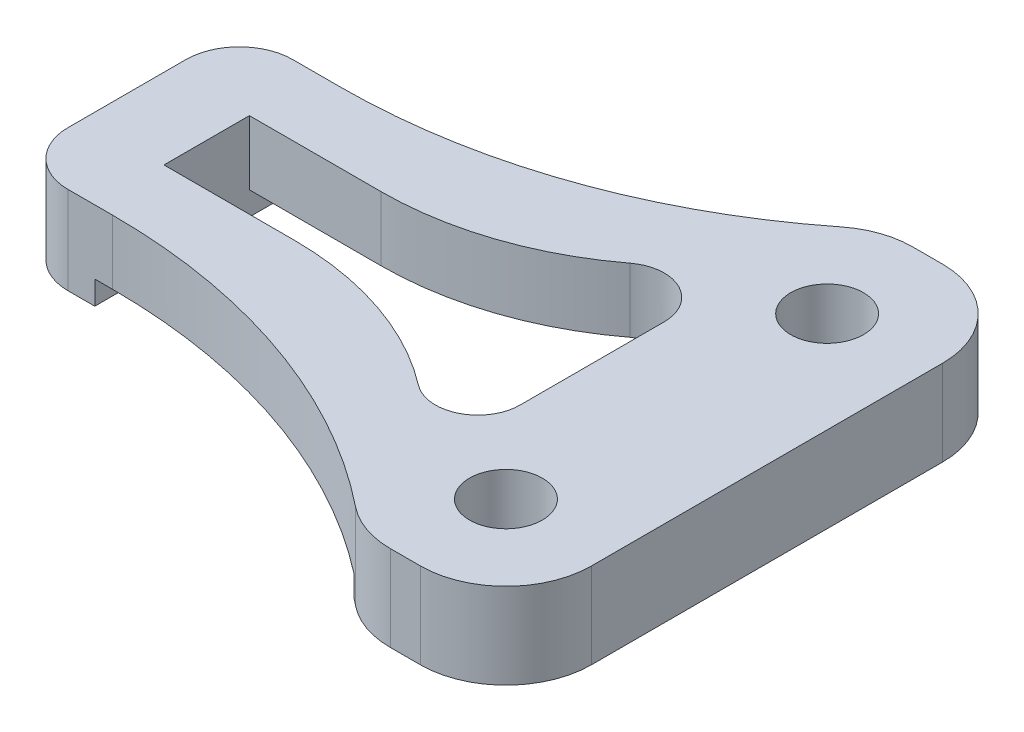
ISO-10303-21;
HEADER;
FILE_DESCRIPTION(('STEP AP214'),'2;1');
FILE_NAME('part.step','',(''),(''),'','','');
FILE_SCHEMA(('AUTOMOTIVE_DESIGN { 1 0 10303 214 1 1 1 1 }'));
ENDSEC;
DATA;
#1=APPLICATION_CONTEXT('core data for automotive mechanical design processes');
#2=APPLICATION_PROTOCOL_DEFINITION('international standard','automotive_design',2000,#1);
#3=PRODUCT_CONTEXT('',#1,'mechanical');
#4=PRODUCT('Part','Part','',(#3));
#5=PRODUCT_RELATED_PRODUCT_CATEGORY('part','',(#4));
#6=PRODUCT_DEFINITION_FORMATION('','',#4);
#7=PRODUCT_DEFINITION_CONTEXT('part definition',#1,'design');
#8=PRODUCT_DEFINITION('design','',#6,#7);
#9=PRODUCT_DEFINITION_SHAPE('','',#8);
#10=(LENGTH_UNIT() NAMED_UNIT(*) SI_UNIT(.MILLI.,.METRE.));
#11=(NAMED_UNIT(*) PLANE_ANGLE_UNIT() SI_UNIT($,.RADIAN.));
#12=(NAMED_UNIT(*) SI_UNIT($,.STERADIAN.) SOLID_ANGLE_UNIT());
#13=UNCERTAINTY_MEASURE_WITH_UNIT(LENGTH_MEASURE(1.E-05),#10,'distance_accuracy_value','');
#14=(GEOMETRIC_REPRESENTATION_CONTEXT(3) GLOBAL_UNCERTAINTY_ASSIGNED_CONTEXT((#13)) GLOBAL_UNIT_ASSIGNED_CONTEXT((#10,
#11,#12)) REPRESENTATION_CONTEXT('',''));
#15=CARTESIAN_POINT('',(0.,0.,0.));
#16=DIRECTION('',(0.,0.,1.));
#17=DIRECTION('',(1.,0.,0.));
#18=AXIS2_PLACEMENT_3D('',#15,#16,#17);
#19=CARTESIAN_POINT('',(-327.159321501741,-45.5999794635909,515.099952697753));
#20=DIRECTION('',(0.,1.,0.));
#21=DIRECTION('',(0.,0.,-1.));
#22=AXIS2_PLACEMENT_3D('',#19,#20,#21);
#23=PLANE('',#22);
#24=DIRECTION('',(0.,0.,1.));
#25=VECTOR('',#24,1.);
#26=CARTESIAN_POINT('',(-336.159321846013,-45.5999794635909,515.099952697753));
#27=LINE('',#26,#25);
#28=CARTESIAN_POINT('',(-336.159321956517,-45.5999794635909,517.070098139785));
#29=VERTEX_POINT('',#28);
#30=CARTESIAN_POINT('',(-336.159321846013,-45.5999794635909,520.29987335205));
#31=VERTEX_POINT('',#30);
#32=EDGE_CURVE('E34',#29,#31,#27,.T.);
#33=ORIENTED_EDGE('',*,*,#32,.F.);
#34=DIRECTION('',(1.,0.,0.));
#35=VECTOR('',#34,1.);
#36=CARTESIAN_POINT('',(-329.747648721169,-45.5999794635909,517.070098139785));
#37=LINE('',#36,#35);
#38=CARTESIAN_POINT('',(-330.074725132549,-45.5999794635909,517.070098139785));
#39=VERTEX_POINT('',#38);
#40=EDGE_CURVE('E11',#29,#39,#37,.T.);
#41=ORIENTED_EDGE('',*,*,#40,.T.);
#42=CARTESIAN_POINT('',(-330.074725132549,-45.5999794635909,531.509585165734));
#43=DIRECTION('',(0.,-1.,0.));
#44=DIRECTION('',(0.,0.,1.));
#45=AXIS2_PLACEMENT_3D('',#42,#43,#44);
#46=CIRCLE('',#45,14.439487025949);
#47=CARTESIAN_POINT('',(-321.309834729179,-45.5999794635909,520.034591405847));
#48=VERTEX_POINT('',#47);
#49=EDGE_CURVE('E26',#39,#48,#46,.T.);
#50=ORIENTED_EDGE('',*,*,#49,.T.);
#51=CARTESIAN_POINT('',(-320.109736823016,-45.5999794635909,518.463423330639));
#52=DIRECTION('',(0.,1.,0.));
#53=DIRECTION('',(-1.,0.,0.));
#54=AXIS2_PLACEMENT_3D('',#51,#52,#53);
#55=CIRCLE('',#54,1.97706957513557);
#56=CARTESIAN_POINT('',(-318.159321846013,-45.5999794635909,518.786974752222));
#57=VERTEX_POINT('',#56);
#58=EDGE_CURVE('E484',#48,#57,#55,.T.);
#59=ORIENTED_EDGE('',*,*,#58,.T.);
#60=DIRECTION('',(0.,0.,-1.));
#61=VECTOR('',#60,1.);
#62=CARTESIAN_POINT('',(-318.159321846013,-45.5999794635909,515.099952697753));
#63=LINE('',#62,#61);
#64=CARTESIAN_POINT('',(-318.159321846013,-45.5999794635909,526.186126269447));
#65=VERTEX_POINT('',#64);
#66=EDGE_CURVE('E264',#65,#57,#63,.T.);
#67=ORIENTED_EDGE('',*,*,#66,.F.);
#68=CARTESIAN_POINT('',(-335.334367405389,-45.5999794635909,548.29987335205));
#69=DIRECTION('',(0.,-1.,0.));
#70=DIRECTION('',(0.,0.,1.));
#71=AXIS2_PLACEMENT_3D('',#68,#69,#70);
#72=CIRCLE('',#71,28.);
#73=CARTESIAN_POINT('',(-335.334367405389,-45.5999794635909,520.29987335205));
#74=VERTEX_POINT('',#73);
#75=EDGE_CURVE('E351',#74,#65,#72,.T.);
#76=ORIENTED_EDGE('',*,*,#75,.F.);
#77=DIRECTION('',(1.,0.,0.));
#78=VECTOR('',#77,1.);
#79=CARTESIAN_POINT('',(-333.534321673877,-45.5999794635909,520.29987335205));
#80=LINE('',#79,#78);
#81=EDGE_CURVE('E465',#31,#74,#80,.T.);
#82=ORIENTED_EDGE('',*,*,#81,.F.);
#83=EDGE_LOOP('',(#33,#41,#50,#59,#67,#76,#82));
#84=FACE_BOUND('',#83,.T.);
#85=ADVANCED_FACE('F16',(#84),#23,.F.);
#86=CARTESIAN_POINT('',(-337.409321846013,-40.5999794635909,517.79987335205));
#87=DIRECTION('',(0.,1.,0.));
#88=DIRECTION('',(-0.707106781186544,0.,0.707106781186551));
#89=AXIS2_PLACEMENT_3D('',#86,#87,#88);
#90=CYLINDRICAL_SURFACE('',#89,2.49999999999997);
#91=CARTESIAN_POINT('',(-337.409321846013,-42.5999794635909,517.79987335205));
#92=DIRECTION('',(0.,-1.,0.));
#93=DIRECTION('',(-0.707106781186544,0.,0.707106781186551));
#94=AXIS2_PLACEMENT_3D('',#91,#92,#93);
#95=CIRCLE('',#94,2.49999999999997);
#96=CARTESIAN_POINT('',(-337.409321846013,-42.5999794635909,520.29987335205));
#97=VERTEX_POINT('',#96);
#98=CARTESIAN_POINT('',(-339.909321846013,-42.5999794635909,517.79987335205));
#99=VERTEX_POINT('',#98);
#100=EDGE_CURVE('E481',#97,#99,#95,.T.);
#101=ORIENTED_EDGE('',*,*,#100,.T.);
#102=DIRECTION('',(0.,-1.,0.));
#103=VECTOR('',#102,1.);
#104=CARTESIAN_POINT('',(-339.909321846013,-40.5999794635909,517.79987335205));
#105=LINE('',#104,#103);
#106=CARTESIAN_POINT('',(-339.909321846013,-46.6999794635909,517.79987335205));
#107=VERTEX_POINT('',#106);
#108=EDGE_CURVE('E478',#99,#107,#105,.T.);
#109=ORIENTED_EDGE('',*,*,#108,.T.);
#110=CARTESIAN_POINT('',(-337.409321846013,-46.6999794635909,517.79987335205));
#111=DIRECTION('',(0.,1.,0.));
#112=DIRECTION('',(-0.707106781186544,0.,0.707106781186551));
#113=AXIS2_PLACEMENT_3D('',#110,#111,#112);
#114=CIRCLE('',#113,2.49999999999997);
#115=CARTESIAN_POINT('',(-337.409321846013,-46.6999794635909,520.29987335205));
#116=VERTEX_POINT('',#115);
#117=EDGE_CURVE('E475',#107,#116,#114,.T.);
#118=ORIENTED_EDGE('',*,*,#117,.T.);
#119=DIRECTION('',(0.,1.,0.));
#120=VECTOR('',#119,1.);
#121=CARTESIAN_POINT('',(-337.409321846013,-40.5999794635909,520.29987335205));
#122=LINE('',#121,#120);
#123=EDGE_CURVE('E471',#116,#97,#122,.T.);
#124=ORIENTED_EDGE('',*,*,#123,.T.);
#125=EDGE_LOOP('',(#101,#109,#118,#124));
#126=FACE_BOUND('',#125,.T.);
#127=ADVANCED_FACE('F527',(#126),#90,.T.);
#128=CARTESIAN_POINT('',(-339.909321846013,-44.599979463591,520.29987335205));
#129=DIRECTION('',(0.,0.,1.));
#130=DIRECTION('',(0.,-1.,0.));
#131=AXIS2_PLACEMENT_3D('',#128,#129,#130);
#132=PLANE('',#131);
#133=ORIENTED_EDGE('',*,*,#123,.F.);
#134=DIRECTION('',(-1.,0.,0.));
#135=VECTOR('',#134,1.);
#136=CARTESIAN_POINT('',(-338.971821846013,-46.6999794635909,520.29987335205));
#137=LINE('',#136,#135);
#138=CARTESIAN_POINT('',(-336.159321846013,-46.6999794635909,520.29987335205));
#139=VERTEX_POINT('',#138);
#140=EDGE_CURVE('E458',#139,#116,#137,.T.);
#141=ORIENTED_EDGE('',*,*,#140,.F.);
#142=DIRECTION('',(0.,1.,0.));
#143=VECTOR('',#142,1.);
#144=CARTESIAN_POINT('',(-336.159321846013,-50.0999794635909,520.29987335205));
#145=LINE('',#144,#143);
#146=EDGE_CURVE('E468',#139,#31,#145,.T.);
#147=ORIENTED_EDGE('',*,*,#146,.T.);
#148=ORIENTED_EDGE('',*,*,#81,.T.);
#149=DIRECTION('',(0.,-1.,0.));
#150=VECTOR('',#149,1.);
#151=CARTESIAN_POINT('',(-335.334367405389,-40.5999794635909,520.29987335205));
#152=LINE('',#151,#150);
#153=CARTESIAN_POINT('',(-335.334367405389,-42.5999794635909,520.29987335205));
#154=VERTEX_POINT('',#153);
#155=EDGE_CURVE('E345',#154,#74,#152,.T.);
#156=ORIENTED_EDGE('',*,*,#155,.F.);
#157=DIRECTION('',(1.,0.,0.));
#158=VECTOR('',#157,1.);
#159=CARTESIAN_POINT('',(-338.971821846013,-42.5999794635909,520.29987335205));
#160=LINE('',#159,#158);
#161=EDGE_CURVE('E293',#97,#154,#160,.T.);
#162=ORIENTED_EDGE('',*,*,#161,.F.);
#163=EDGE_LOOP('',(#133,#141,#147,#148,#156,#162));
#164=FACE_BOUND('',#163,.T.);
#165=ADVANCED_FACE('F498',(#164),#132,.T.);
#166=CARTESIAN_POINT('',(-338.034321846013,-46.6999794635909,515.099948883056));
#167=DIRECTION('',(0.,1.,0.));
#168=DIRECTION('',(0.,0.,1.));
#169=AXIS2_PLACEMENT_3D('',#166,#167,#168);
#170=PLANE('',#169);
#171=ORIENTED_EDGE('',*,*,#117,.F.);
#172=DIRECTION('',(0.,0.,-1.));
#173=VECTOR('',#172,1.);
#174=CARTESIAN_POINT('',(-339.909321846013,-46.6999794635909,515.099948883056));
#175=LINE('',#174,#173);
#176=CARTESIAN_POINT('',(-339.909321846013,-46.6999794635909,512.29987335205));
#177=VERTEX_POINT('',#176);
#178=EDGE_CURVE('E461',#107,#177,#175,.T.);
#179=ORIENTED_EDGE('',*,*,#178,.T.);
#180=CARTESIAN_POINT('',(-337.409321846013,-46.6999794635909,512.29987335205));
#181=DIRECTION('',(0.,1.,0.));
#182=DIRECTION('',(-0.707106781186544,0.,-0.707106781186551));
#183=AXIS2_PLACEMENT_3D('',#180,#181,#182);
#184=CIRCLE('',#183,2.49999999999997);
#185=CARTESIAN_POINT('',(-337.409321846013,-46.6999794635909,509.79987335205));
#186=VERTEX_POINT('',#185);
#187=EDGE_CURVE('E453',#186,#177,#184,.T.);
#188=ORIENTED_EDGE('',*,*,#187,.F.);
#189=DIRECTION('',(1.,0.,0.));
#190=VECTOR('',#189,1.);
#191=CARTESIAN_POINT('',(-338.971821846013,-46.6999794635909,509.79987335205));
#192=LINE('',#191,#190);
#193=CARTESIAN_POINT('',(-336.159321846013,-46.6999794635909,509.79987335205));
#194=VERTEX_POINT('',#193);
#195=EDGE_CURVE('E457',#186,#194,#192,.T.);
#196=ORIENTED_EDGE('',*,*,#195,.T.);
#197=DIRECTION('',(0.,0.,1.));
#198=VECTOR('',#197,1.);
#199=CARTESIAN_POINT('',(-336.159321956517,-46.6999794635909,515.099946953839));
#200=LINE('',#199,#198);
#201=EDGE_CURVE('E454',#194,#139,#200,.T.);
#202=ORIENTED_EDGE('',*,*,#201,.T.);
#203=ORIENTED_EDGE('',*,*,#140,.T.);
#204=EDGE_LOOP('',(#171,#179,#188,#196,#202,#203));
#205=FACE_BOUND('',#204,.T.);
#206=ADVANCED_FACE('F500',(#205),#170,.F.);
#207=CARTESIAN_POINT('',(-337.409321846013,-40.5999794635909,512.29987335205));
#208=DIRECTION('',(0.,-1.,0.));
#209=DIRECTION('',(-0.707106781186544,0.,-0.707106781186551));
#210=AXIS2_PLACEMENT_3D('',#207,#208,#209);
#211=CYLINDRICAL_SURFACE('',#210,2.49999999999997);
#212=ORIENTED_EDGE('',*,*,#187,.T.);
#213=DIRECTION('',(0.,1.,0.));
#214=VECTOR('',#213,1.);
#215=CARTESIAN_POINT('',(-339.909321846013,-40.5999794635909,512.29987335205));
#216=LINE('',#215,#214);
#217=CARTESIAN_POINT('',(-339.909321846013,-42.5999794635909,512.29987335205));
#218=VERTEX_POINT('',#217);
#219=EDGE_CURVE('E450',#177,#218,#216,.T.);
#220=ORIENTED_EDGE('',*,*,#219,.T.);
#221=CARTESIAN_POINT('',(-337.409321846013,-42.5999794635909,512.29987335205));
#222=DIRECTION('',(0.,-1.,0.));
#223=DIRECTION('',(-0.707106781186544,0.,-0.707106781186551));
#224=AXIS2_PLACEMENT_3D('',#221,#222,#223);
#225=CIRCLE('',#224,2.49999999999997);
#226=CARTESIAN_POINT('',(-337.409321846013,-42.5999794635909,509.79987335205));
#227=VERTEX_POINT('',#226);
#228=EDGE_CURVE('E447',#218,#227,#225,.T.);
#229=ORIENTED_EDGE('',*,*,#228,.T.);
#230=DIRECTION('',(0.,-1.,0.));
#231=VECTOR('',#230,1.);
#232=CARTESIAN_POINT('',(-337.409321846013,-40.5999794635909,509.79987335205));
#233=LINE('',#232,#231);
#234=EDGE_CURVE('E442',#227,#186,#233,.T.);
#235=ORIENTED_EDGE('',*,*,#234,.T.);
#236=EDGE_LOOP('',(#212,#220,#229,#235));
#237=FACE_BOUND('',#236,.T.);
#238=ADVANCED_FACE('F539',(#237),#211,.T.);
#239=CARTESIAN_POINT('',(-339.909321846013,-44.599979463591,509.79987335205));
#240=DIRECTION('',(0.,0.,1.));
#241=DIRECTION('',(0.,-1.,0.));
#242=AXIS2_PLACEMENT_3D('',#239,#240,#241);
#243=PLANE('',#242);
#244=ORIENTED_EDGE('',*,*,#234,.F.);
#245=DIRECTION('',(-1.,0.,0.));
#246=VECTOR('',#245,1.);
#247=CARTESIAN_POINT('',(-338.971821846013,-42.5999794635909,509.79987335205));
#248=LINE('',#247,#246);
#249=CARTESIAN_POINT('',(-335.208393298212,-42.5999794635909,509.79987335205));
#250=VERTEX_POINT('',#249);
#251=EDGE_CURVE('E241',#250,#227,#248,.T.);
#252=ORIENTED_EDGE('',*,*,#251,.F.);
#253=DIRECTION('',(0.,1.,0.));
#254=VECTOR('',#253,1.);
#255=CARTESIAN_POINT('',(-335.208393298212,-40.5999794635909,509.79987335205));
#256=LINE('',#255,#254);
#257=CARTESIAN_POINT('',(-335.208393298212,-45.5999794635909,509.79987335205));
#258=VERTEX_POINT('',#257);
#259=EDGE_CURVE('E337',#258,#250,#256,.T.);
#260=ORIENTED_EDGE('',*,*,#259,.F.);
#261=DIRECTION('',(-1.,0.,0.));
#262=VECTOR('',#261,1.);
#263=CARTESIAN_POINT('',(-333.534321673877,-45.5999794635909,509.79987335205));
#264=LINE('',#263,#262);
#265=CARTESIAN_POINT('',(-336.159321846013,-45.5999794635909,509.79987335205));
#266=VERTEX_POINT('',#265);
#267=EDGE_CURVE('E439',#258,#266,#264,.T.);
#268=ORIENTED_EDGE('',*,*,#267,.T.);
#269=DIRECTION('',(0.,-1.,0.));
#270=VECTOR('',#269,1.);
#271=CARTESIAN_POINT('',(-336.159321846013,-50.0999794635909,509.79987335205));
#272=LINE('',#271,#270);
#273=EDGE_CURVE('E398',#266,#194,#272,.T.);
#274=ORIENTED_EDGE('',*,*,#273,.T.);
#275=ORIENTED_EDGE('',*,*,#195,.F.);
#276=EDGE_LOOP('',(#244,#252,#260,#268,#274,#275));
#277=FACE_BOUND('',#276,.T.);
#278=ADVANCED_FACE('F504',(#277),#243,.F.);
#279=CARTESIAN_POINT('',(-318.132667247881,-31.1458403133198,515.099945024623));
#280=DIRECTION('',(-1.,0.,0.));
#281=DIRECTION('',(0.,-1.,0.));
#282=AXIS2_PLACEMENT_3D('',#279,#280,#281);
#283=PLANE('',#282);
#284=DIRECTION('',(0.,0.,1.));
#285=VECTOR('',#284,1.);
#286=CARTESIAN_POINT('',(-318.132667247881,-42.5999794635909,515.099946953839));
#287=LINE('',#286,#285);
#288=CARTESIAN_POINT('',(-318.132667247881,-42.5999794635909,511.734290393786));
#289=VERTEX_POINT('',#288);
#290=CARTESIAN_POINT('',(-318.132667247881,-42.5999794635909,518.463423330639));
#291=VERTEX_POINT('',#290);
#292=EDGE_CURVE('E331',#289,#291,#287,.T.);
#293=ORIENTED_EDGE('',*,*,#292,.F.);
#294=DIRECTION('',(0.,-1.,0.));
#295=VECTOR('',#294,1.);
#296=CARTESIAN_POINT('',(-318.132667247881,-33.1229098884554,511.734290393786));
#297=LINE('',#296,#295);
#298=CARTESIAN_POINT('',(-318.132667247881,-46.5999794635909,511.734290393786));
#299=VERTEX_POINT('',#298);
#300=EDGE_CURVE('E394',#289,#299,#297,.T.);
#301=ORIENTED_EDGE('',*,*,#300,.T.);
#302=DIRECTION('',(0.,0.,-1.));
#303=VECTOR('',#302,1.);
#304=CARTESIAN_POINT('',(-318.132667247881,-46.5999794635909,515.099946953839));
#305=LINE('',#304,#303);
#306=CARTESIAN_POINT('',(-318.132667247881,-46.5999794635909,518.463423330639));
#307=VERTEX_POINT('',#306);
#308=EDGE_CURVE('E260',#307,#299,#305,.T.);
#309=ORIENTED_EDGE('',*,*,#308,.F.);
#310=DIRECTION('',(0.,1.,0.));
#311=VECTOR('',#310,1.);
#312=CARTESIAN_POINT('',(-318.132667247881,-33.1229098884554,518.463423330639));
#313=LINE('',#312,#311);
#314=EDGE_CURVE('E386',#307,#291,#313,.T.);
#315=ORIENTED_EDGE('',*,*,#314,.T.);
#316=EDGE_LOOP('',(#293,#301,#309,#315));
#317=FACE_BOUND('',#316,.T.);
#318=ADVANCED_FACE('F395',(#317),#283,.T.);
#319=CARTESIAN_POINT('',(-332.335975940596,-35.0999794635909,513.080290505055));
#320=DIRECTION('',(0.,0.,1.));
#321=DIRECTION('',(0.,-1.,0.));
#322=AXIS2_PLACEMENT_3D('',#319,#320,#321);
#323=PLANE('',#322);
#324=DIRECTION('',(1.,0.,0.));
#325=VECTOR('',#324,1.);
#326=CARTESIAN_POINT('',(-335.185148893304,-42.5999794635909,513.080290505055));
#327=LINE('',#326,#325);
#328=CARTESIAN_POINT('',(-336.159321956517,-42.5999794635909,513.080290505055));
#329=VERTEX_POINT('',#328);
#330=CARTESIAN_POINT('',(-330.01246023891,-42.5999794635909,513.080290505055));
#331=VERTEX_POINT('',#330);
#332=EDGE_CURVE('E279',#329,#331,#327,.T.);
#333=ORIENTED_EDGE('',*,*,#332,.F.);
#334=DIRECTION('',(0.,-1.,0.));
#335=VECTOR('',#334,1.);
#336=CARTESIAN_POINT('',(-336.159321956517,-33.1229098884553,513.080290505055));
#337=LINE('',#336,#335);
#338=CARTESIAN_POINT('',(-336.159321901265,-45.5999794635909,513.080290505055));
#339=VERTEX_POINT('',#338);
#340=EDGE_CURVE('E432',#329,#339,#337,.T.);
#341=ORIENTED_EDGE('',*,*,#340,.T.);
#342=DIRECTION('',(-1.,0.,0.));
#343=VECTOR('',#342,1.);
#344=CARTESIAN_POINT('',(-329.747648721169,-45.5999794635909,513.080290505055));
#345=LINE('',#344,#343);
#346=CARTESIAN_POINT('',(-330.01246023891,-45.5999794635909,513.080290505055));
#347=VERTEX_POINT('',#346);
#348=EDGE_CURVE('E418',#347,#339,#345,.T.);
#349=ORIENTED_EDGE('',*,*,#348,.F.);
#350=DIRECTION('',(0.,1.,0.));
#351=VECTOR('',#350,1.);
#352=CARTESIAN_POINT('',(-330.01246023891,-33.1229098884553,513.080290505055));
#353=LINE('',#352,#351);
#354=EDGE_CURVE('E414',#347,#331,#353,.T.);
#355=ORIENTED_EDGE('',*,*,#354,.T.);
#356=EDGE_LOOP('',(#333,#341,#349,#355));
#357=FACE_BOUND('',#356,.T.);
#358=ADVANCED_FACE('F547',(#357),#323,.T.);
#359=CARTESIAN_POINT('',(-320.109736823016,-33.1229098884554,511.734290393786));
#360=DIRECTION('',(0.,1.,0.));
#361=DIRECTION('',(-1.,0.,0.));
#362=AXIS2_PLACEMENT_3D('',#359,#360,#361);
#363=CYLINDRICAL_SURFACE('',#362,1.97706957513556);
#364=CARTESIAN_POINT('',(-320.109736823016,-42.5999794635909,511.734290393786));
#365=DIRECTION('',(0.,-1.,0.));
#366=DIRECTION('',(-1.,0.,0.));
#367=AXIS2_PLACEMENT_3D('',#364,#365,#366);
#368=CIRCLE('',#367,1.97706957513556);
#369=CARTESIAN_POINT('',(-321.302336078286,-42.5999794635909,510.157422891028));
#370=VERTEX_POINT('',#369);
#371=EDGE_CURVE('E407',#370,#289,#368,.T.);
#372=ORIENTED_EDGE('',*,*,#371,.F.);
#373=DIRECTION('',(0.,1.,0.));
#374=VECTOR('',#373,1.);
#375=CARTESIAN_POINT('',(-321.302336078286,-33.1229098884554,510.157422891028));
#376=LINE('',#375,#374);
#377=CARTESIAN_POINT('',(-321.302336078286,-45.5999794635909,510.157422891028));
#378=VERTEX_POINT('',#377);
#379=EDGE_CURVE('E267',#378,#370,#376,.T.);
#380=ORIENTED_EDGE('',*,*,#379,.F.);
#381=CARTESIAN_POINT('',(-320.109736823016,-45.5999794635909,511.734290393786));
#382=DIRECTION('',(0.,1.,0.));
#383=DIRECTION('',(-1.,0.,0.));
#384=AXIS2_PLACEMENT_3D('',#381,#382,#383);
#385=CIRCLE('',#384,1.97706957513556);
#386=CARTESIAN_POINT('',(-318.159321846013,-45.5999794635909,511.410738972204));
#387=VERTEX_POINT('',#386);
#388=EDGE_CURVE('E417',#387,#378,#385,.T.);
#389=ORIENTED_EDGE('',*,*,#388,.F.);
#390=DIRECTION('',(0.,1.,0.));
#391=VECTOR('',#390,1.);
#392=CARTESIAN_POINT('',(-318.159321846013,-33.1229098884554,511.410738972204));
#393=LINE('',#392,#391);
#394=CARTESIAN_POINT('',(-318.159321846013,-46.5999794635909,511.410738972204));
#395=VERTEX_POINT('',#394);
#396=EDGE_CURVE('E320',#395,#387,#393,.T.);
#397=ORIENTED_EDGE('',*,*,#396,.F.);
#398=CARTESIAN_POINT('',(-320.109736823016,-46.5999794635909,511.734290393786));
#399=DIRECTION('',(0.,1.,0.));
#400=DIRECTION('',(-1.,0.,0.));
#401=AXIS2_PLACEMENT_3D('',#398,#399,#400);
#402=CIRCLE('',#401,1.97706957513556);
#403=EDGE_CURVE('E285',#299,#395,#402,.T.);
#404=ORIENTED_EDGE('',*,*,#403,.F.);
#405=ORIENTED_EDGE('',*,*,#300,.F.);
#406=EDGE_LOOP('',(#372,#380,#389,#397,#404,#405));
#407=FACE_BOUND('',#406,.T.);
#408=ADVANCED_FACE('F400',(#407),#363,.F.);
#409=CARTESIAN_POINT('',(-330.01246023891,-33.1229098884553,498.640803479105));
#410=DIRECTION('',(0.,1.,0.));
#411=DIRECTION('',(0.,0.,-1.));
#412=AXIS2_PLACEMENT_3D('',#409,#410,#411);
#413=CYLINDRICAL_SURFACE('',#412,14.439487025949);
#414=CARTESIAN_POINT('',(-330.01246023891,-42.5999794635909,498.640803479105));
#415=DIRECTION('',(0.,1.,0.));
#416=DIRECTION('',(0.,0.,-1.));
#417=AXIS2_PLACEMENT_3D('',#414,#415,#416);
#418=CIRCLE('',#417,14.439487025949);
#419=EDGE_CURVE('E405',#331,#370,#418,.T.);
#420=ORIENTED_EDGE('',*,*,#419,.F.);
#421=ORIENTED_EDGE('',*,*,#354,.F.);
#422=CARTESIAN_POINT('',(-330.01246023891,-45.5999794635909,498.640803479105));
#423=DIRECTION('',(0.,-1.,0.));
#424=DIRECTION('',(0.,0.,-1.));
#425=AXIS2_PLACEMENT_3D('',#422,#423,#424);
#426=CIRCLE('',#425,14.439487025949);
#427=EDGE_CURVE('E254',#378,#347,#426,.T.);
#428=ORIENTED_EDGE('',*,*,#427,.F.);
#429=ORIENTED_EDGE('',*,*,#379,.T.);
#430=EDGE_LOOP('',(#420,#421,#428,#429));
#431=FACE_BOUND('',#430,.T.);
#432=ADVANCED_FACE('F429',(#431),#413,.T.);
#433=CARTESIAN_POINT('',(-320.109736823016,-33.1229098884554,518.463423330639));
#434=DIRECTION('',(0.,-1.,0.));
#435=DIRECTION('',(-1.,0.,0.));
#436=AXIS2_PLACEMENT_3D('',#433,#434,#435);
#437=CYLINDRICAL_SURFACE('',#436,1.97706957513557);
#438=CARTESIAN_POINT('',(-320.109736823016,-42.5999794635909,518.463423330639));
#439=DIRECTION('',(0.,-1.,0.));
#440=DIRECTION('',(-1.,0.,0.));
#441=AXIS2_PLACEMENT_3D('',#438,#439,#440);
#442=CIRCLE('',#441,1.97706957513557);
#443=CARTESIAN_POINT('',(-321.309834729179,-42.5999794635909,520.034591405847));
#444=VERTEX_POINT('',#443);
#445=EDGE_CURVE('E242',#291,#444,#442,.T.);
#446=ORIENTED_EDGE('',*,*,#445,.F.);
#447=ORIENTED_EDGE('',*,*,#314,.F.);
#448=CARTESIAN_POINT('',(-320.109736823016,-46.5999794635909,518.463423330639));
#449=DIRECTION('',(0.,1.,0.));
#450=DIRECTION('',(-1.,0.,0.));
#451=AXIS2_PLACEMENT_3D('',#448,#449,#450);
#452=CIRCLE('',#451,1.97706957513557);
#453=CARTESIAN_POINT('',(-318.159321846013,-46.5999794635909,518.786974752222));
#454=VERTEX_POINT('',#453);
#455=EDGE_CURVE('E256',#454,#307,#452,.T.);
#456=ORIENTED_EDGE('',*,*,#455,.F.);
#457=DIRECTION('',(0.,-1.,0.));
#458=VECTOR('',#457,1.);
#459=CARTESIAN_POINT('',(-318.159321846013,-33.1229098884554,518.786974752222));
#460=LINE('',#459,#458);
#461=EDGE_CURVE('E261',#57,#454,#460,.T.);
#462=ORIENTED_EDGE('',*,*,#461,.F.);
#463=ORIENTED_EDGE('',*,*,#58,.F.);
#464=DIRECTION('',(0.,-1.,0.));
#465=VECTOR('',#464,1.);
#466=CARTESIAN_POINT('',(-321.309834729179,-33.1229098884554,520.034591405847));
#467=LINE('',#466,#465);
#468=EDGE_CURVE('E265',#444,#48,#467,.T.);
#469=ORIENTED_EDGE('',*,*,#468,.F.);
#470=EDGE_LOOP('',(#446,#447,#456,#462,#463,#469));
#471=FACE_BOUND('',#470,.T.);
#472=ADVANCED_FACE('F384',(#471),#437,.F.);
#473=CARTESIAN_POINT('',(-330.074725132549,-33.1229098884553,531.509585165734));
#474=DIRECTION('',(0.,-1.,0.));
#475=DIRECTION('',(0.,0.,1.));
#476=AXIS2_PLACEMENT_3D('',#473,#474,#475);
#477=CYLINDRICAL_SURFACE('',#476,14.439487025949);
#478=CARTESIAN_POINT('',(-330.074725132549,-42.5999794635909,531.509585165734));
#479=DIRECTION('',(0.,1.,0.));
#480=DIRECTION('',(0.,0.,1.));
#481=AXIS2_PLACEMENT_3D('',#478,#479,#480);
#482=CIRCLE('',#481,14.439487025949);
#483=CARTESIAN_POINT('',(-330.074725132549,-42.5999794635909,517.070098139785));
#484=VERTEX_POINT('',#483);
#485=EDGE_CURVE('E246',#444,#484,#482,.T.);
#486=ORIENTED_EDGE('',*,*,#485,.F.);
#487=ORIENTED_EDGE('',*,*,#468,.T.);
#488=ORIENTED_EDGE('',*,*,#49,.F.);
#489=DIRECTION('',(0.,-1.,0.));
#490=VECTOR('',#489,1.);
#491=CARTESIAN_POINT('',(-330.074725132549,-33.1229098884553,517.070098139785));
#492=LINE('',#491,#490);
#493=EDGE_CURVE('E268',#484,#39,#492,.T.);
#494=ORIENTED_EDGE('',*,*,#493,.F.);
#495=EDGE_LOOP('',(#486,#487,#488,#494));
#496=FACE_BOUND('',#495,.T.);
#497=ADVANCED_FACE('F556',(#496),#477,.T.);
#498=CARTESIAN_POINT('',(-332.335975940596,-35.0999794635909,517.070098139785));
#499=DIRECTION('',(0.,0.,1.));
#500=DIRECTION('',(0.,-1.,0.));
#501=AXIS2_PLACEMENT_3D('',#498,#499,#500);
#502=PLANE('',#501);
#503=DIRECTION('',(-1.,0.,0.));
#504=VECTOR('',#503,1.);
#505=CARTESIAN_POINT('',(-335.185148893304,-42.5999794635909,517.070098139785));
#506=LINE('',#505,#504);
#507=CARTESIAN_POINT('',(-336.159321956517,-42.5999794635909,517.070098139785));
#508=VERTEX_POINT('',#507);
#509=EDGE_CURVE('E250',#484,#508,#506,.T.);
#510=ORIENTED_EDGE('',*,*,#509,.F.);
#511=ORIENTED_EDGE('',*,*,#493,.T.);
#512=ORIENTED_EDGE('',*,*,#40,.F.);
#513=DIRECTION('',(0.,1.,0.));
#514=VECTOR('',#513,1.);
#515=CARTESIAN_POINT('',(-336.159321956517,-33.1229098884553,517.070098139785));
#516=LINE('',#515,#514);
#517=EDGE_CURVE('E272',#29,#508,#516,.T.);
#518=ORIENTED_EDGE('',*,*,#517,.T.);
#519=EDGE_LOOP('',(#510,#511,#512,#518));
#520=FACE_BOUND('',#519,.T.);
#521=ADVANCED_FACE('F559',(#520),#502,.F.);
#522=CARTESIAN_POINT('',(-336.159321956517,-31.1458403133197,515.099945024623));
#523=DIRECTION('',(1.,0.,0.));
#524=DIRECTION('',(0.,1.,0.));
#525=AXIS2_PLACEMENT_3D('',#522,#523,#524);
#526=PLANE('',#525);
#527=DIRECTION('',(0.,0.,-1.));
#528=VECTOR('',#527,1.);
#529=CARTESIAN_POINT('',(-336.159321956517,-42.5999794635909,515.099946953839));
#530=LINE('',#529,#528);
#531=EDGE_CURVE('E274',#508,#329,#530,.T.);
#532=ORIENTED_EDGE('',*,*,#531,.F.);
#533=ORIENTED_EDGE('',*,*,#517,.F.);
#534=ORIENTED_EDGE('',*,*,#32,.T.);
#535=ORIENTED_EDGE('',*,*,#146,.F.);
#536=ORIENTED_EDGE('',*,*,#201,.F.);
#537=ORIENTED_EDGE('',*,*,#273,.F.);
#538=DIRECTION('',(0.,0.,1.));
#539=VECTOR('',#538,1.);
#540=CARTESIAN_POINT('',(-336.159321846013,-45.5999794635909,515.099952697753));
#541=LINE('',#540,#539);
#542=EDGE_CURVE('E259',#266,#339,#541,.T.);
#543=ORIENTED_EDGE('',*,*,#542,.T.);
#544=ORIENTED_EDGE('',*,*,#340,.F.);
#545=EDGE_LOOP('',(#532,#533,#534,#535,#536,#537,#543,#544));
#546=FACE_BOUND('',#545,.T.);
#547=ADVANCED_FACE('F496',(#546),#526,.T.);
#548=CARTESIAN_POINT('',(-338.034321846013,-46.5999794635909,515.099948883056));
#549=DIRECTION('',(0.,1.,0.));
#550=DIRECTION('',(0.,0.,1.));
#551=AXIS2_PLACEMENT_3D('',#548,#549,#550);
#552=PLANE('',#551);
#553=ORIENTED_EDGE('',*,*,#455,.T.);
#554=ORIENTED_EDGE('',*,*,#308,.T.);
#555=ORIENTED_EDGE('',*,*,#403,.T.);
#556=DIRECTION('',(0.,0.,-1.));
#557=VECTOR('',#556,1.);
#558=CARTESIAN_POINT('',(-318.159321846013,-46.5999794635909,515.099950790405));
#559=LINE('',#558,#557);
#560=CARTESIAN_POINT('',(-318.159321846013,-46.5999794635909,504.01088779574));
#561=VERTEX_POINT('',#560);
#562=EDGE_CURVE('E282',#395,#561,#559,.T.);
#563=ORIENTED_EDGE('',*,*,#562,.T.);
#564=CARTESIAN_POINT('',(-335.208393298212,-46.5999794635909,481.79987335205));
#565=DIRECTION('',(0.,1.,0.));
#566=DIRECTION('',(0.,0.,-1.));
#567=AXIS2_PLACEMENT_3D('',#564,#565,#566);
#568=CIRCLE('',#567,28.);
#569=CARTESIAN_POINT('',(-317.840455858473,-46.5999794635909,503.762449455261));
#570=VERTEX_POINT('',#569);
#571=EDGE_CURVE('E286',#561,#570,#568,.T.);
#572=ORIENTED_EDGE('',*,*,#571,.T.);
#573=CARTESIAN_POINT('',(-315.35932193851,-46.5999794635909,506.899960327148));
#574=DIRECTION('',(0.,1.,0.));
#575=DIRECTION('',(-0.707106781186542,0.,-0.707106781186553));
#576=AXIS2_PLACEMENT_3D('',#573,#574,#575);
#577=CIRCLE('',#576,4.);
#578=CARTESIAN_POINT('',(-315.35932193851,-46.5999794635909,502.899960327148));
#579=VERTEX_POINT('',#578);
#580=EDGE_CURVE('E290',#579,#570,#577,.T.);
#581=ORIENTED_EDGE('',*,*,#580,.F.);
#582=DIRECTION('',(1.,0.,0.));
#583=VECTOR('',#582,1.);
#584=CARTESIAN_POINT('',(-338.034321846013,-46.5999794635909,502.899960327148));
#585=LINE('',#584,#583);
#586=CARTESIAN_POINT('',(-313.959321342464,-46.5999794635909,502.899960327148));
#587=VERTEX_POINT('',#586);
#588=EDGE_CURVE('E289',#579,#587,#585,.T.);
#589=ORIENTED_EDGE('',*,*,#588,.T.);
#590=CARTESIAN_POINT('',(-313.959321342464,-46.5999794635909,506.899960327148));
#591=DIRECTION('',(0.,1.,0.));
#592=DIRECTION('',(0.707106781186541,0.,-0.707106781186554));
#593=AXIS2_PLACEMENT_3D('',#590,#591,#592);
#594=CIRCLE('',#593,3.99999999999999);
#595=CARTESIAN_POINT('',(-309.959321342464,-46.5999794635909,506.899960327148));
#596=VERTEX_POINT('',#595);
#597=EDGE_CURVE('E296',#596,#587,#594,.T.);
#598=ORIENTED_EDGE('',*,*,#597,.F.);
#599=DIRECTION('',(0.,0.,1.));
#600=VECTOR('',#599,1.);
#601=CARTESIAN_POINT('',(-309.959321342464,-46.5999794635909,515.099948883056));
#602=LINE('',#601,#600);
#603=CARTESIAN_POINT('',(-309.959321342464,-46.5999794635909,523.299922180175));
#604=VERTEX_POINT('',#603);
#605=EDGE_CURVE('E226',#596,#604,#602,.T.);
#606=ORIENTED_EDGE('',*,*,#605,.T.);
#607=CARTESIAN_POINT('',(-313.959321342464,-46.5999794635909,523.299922180175));
#608=DIRECTION('',(0.,1.,0.));
#609=DIRECTION('',(0.707106781186541,0.,0.707106781186554));
#610=AXIS2_PLACEMENT_3D('',#607,#608,#609);
#611=CIRCLE('',#610,3.99999999999999);
#612=CARTESIAN_POINT('',(-313.959321342464,-46.5999794635909,527.299922180175));
#613=VERTEX_POINT('',#612);
#614=EDGE_CURVE('E227',#613,#604,#611,.T.);
#615=ORIENTED_EDGE('',*,*,#614,.F.);
#616=DIRECTION('',(-1.,0.,0.));
#617=VECTOR('',#616,1.);
#618=CARTESIAN_POINT('',(-338.034321846013,-46.5999794635909,527.299922180175));
#619=LINE('',#618,#617);
#620=CARTESIAN_POINT('',(-315.35932193851,-46.5999794635909,527.299922180175));
#621=VERTEX_POINT('',#620);
#622=EDGE_CURVE('E299',#613,#621,#619,.T.);
#623=ORIENTED_EDGE('',*,*,#622,.T.);
#624=CARTESIAN_POINT('',(-315.35932193851,-46.5999794635909,523.299922180175));
#625=DIRECTION('',(0.,1.,0.));
#626=DIRECTION('',(-0.707106781186542,0.,0.707106781186553));
#627=AXIS2_PLACEMENT_3D('',#624,#625,#626);
#628=CIRCLE('',#627,4.);
#629=CARTESIAN_POINT('',(-317.85620262187,-46.5999794635909,526.42491607666));
#630=VERTEX_POINT('',#629);
#631=EDGE_CURVE('E304',#630,#621,#628,.T.);
#632=ORIENTED_EDGE('',*,*,#631,.F.);
#633=CARTESIAN_POINT('',(-335.334367405389,-46.5999794635909,548.29987335205));
#634=DIRECTION('',(0.,-1.,0.));
#635=DIRECTION('',(0.,0.,1.));
#636=AXIS2_PLACEMENT_3D('',#633,#634,#635);
#637=CIRCLE('',#636,28.);
#638=CARTESIAN_POINT('',(-318.159321846013,-46.5999794635909,526.186126269447));
#639=VERTEX_POINT('',#638);
#640=EDGE_CURVE('E307',#639,#630,#637,.T.);
#641=ORIENTED_EDGE('',*,*,#640,.F.);
#642=DIRECTION('',(0.,0.,-1.));
#643=VECTOR('',#642,1.);
#644=CARTESIAN_POINT('',(-318.159321846013,-46.5999794635909,515.099950790405));
#645=LINE('',#644,#643);
#646=EDGE_CURVE('E303',#639,#454,#645,.T.);
#647=ORIENTED_EDGE('',*,*,#646,.T.);
#648=EDGE_LOOP('',(#553,#554,#555,#563,#572,#581,#589,#598,#606,#615,#623,#632,#641,#647));
#649=FACE_BOUND('',#648,.T.);
#650=CARTESIAN_POINT('',(-314.659321846013,-46.5999794635909,507.599948883056));
#651=DIRECTION('',(0.,1.,0.));
#652=DIRECTION('',(0.,0.,-1.));
#653=AXIS2_PLACEMENT_3D('',#650,#651,#652);
#654=CIRCLE('',#653,1.7);
#655=CARTESIAN_POINT('',(-314.659321846013,-46.5999794635909,505.899948883056));
#656=VERTEX_POINT('',#655);
#657=EDGE_CURVE('E314',#656,#656,#654,.T.);
#658=ORIENTED_EDGE('',*,*,#657,.T.);
#659=EDGE_LOOP('',(#658));
#660=FACE_BOUND('',#659,.T.);
#661=CARTESIAN_POINT('',(-314.659321846013,-46.5999794635909,522.599948883056));
#662=DIRECTION('',(0.,1.,0.));
#663=DIRECTION('',(0.,0.,-1.));
#664=AXIS2_PLACEMENT_3D('',#661,#662,#663);
#665=CIRCLE('',#664,1.7);
#666=CARTESIAN_POINT('',(-314.659321846013,-46.5999794635909,520.899948883056));
#667=VERTEX_POINT('',#666);
#668=EDGE_CURVE('E317',#667,#667,#665,.T.);
#669=ORIENTED_EDGE('',*,*,#668,.T.);
#670=EDGE_LOOP('',(#669));
#671=FACE_BOUND('',#670,.T.);
#672=ADVANCED_FACE('F374',(#649,#660,#671),#552,.F.);
#673=CARTESIAN_POINT('',(-318.159321846013,-55.5999794635909,515.099952697753));
#674=DIRECTION('',(-1.,0.,0.));
#675=DIRECTION('',(0.,1.,0.));
#676=AXIS2_PLACEMENT_3D('',#673,#674,#675);
#677=PLANE('',#676);
#678=ORIENTED_EDGE('',*,*,#396,.T.);
#679=DIRECTION('',(0.,0.,-1.));
#680=VECTOR('',#679,1.);
#681=CARTESIAN_POINT('',(-318.159321846013,-45.5999794635909,515.099952697753));
#682=LINE('',#681,#680);
#683=CARTESIAN_POINT('',(-318.159321846013,-45.5999794635909,504.01088779574));
#684=VERTEX_POINT('',#683);
#685=EDGE_CURVE('E263',#387,#684,#682,.T.);
#686=ORIENTED_EDGE('',*,*,#685,.T.);
#687=DIRECTION('',(0.,1.,0.));
#688=VECTOR('',#687,1.);
#689=CARTESIAN_POINT('',(-318.159321846013,-40.5999794635909,504.01088779574));
#690=LINE('',#689,#688);
#691=EDGE_CURVE('E323',#561,#684,#690,.T.);
#692=ORIENTED_EDGE('',*,*,#691,.F.);
#693=ORIENTED_EDGE('',*,*,#562,.F.);
#694=EDGE_LOOP('',(#678,#686,#692,#693));
#695=FACE_BOUND('',#694,.T.);
#696=ADVANCED_FACE('F511',(#695),#677,.T.);
#697=CARTESIAN_POINT('',(-318.159321846013,-55.5999794635909,515.099952697753));
#698=DIRECTION('',(-1.,0.,0.));
#699=DIRECTION('',(0.,1.,0.));
#700=AXIS2_PLACEMENT_3D('',#697,#698,#699);
#701=PLANE('',#700);
#702=ORIENTED_EDGE('',*,*,#461,.T.);
#703=ORIENTED_EDGE('',*,*,#646,.F.);
#704=DIRECTION('',(0.,-1.,0.));
#705=VECTOR('',#704,1.);
#706=CARTESIAN_POINT('',(-318.159321846013,-40.5999794635909,526.186126269447));
#707=LINE('',#706,#705);
#708=EDGE_CURVE('E310',#65,#639,#707,.T.);
#709=ORIENTED_EDGE('',*,*,#708,.F.);
#710=ORIENTED_EDGE('',*,*,#66,.T.);
#711=EDGE_LOOP('',(#702,#703,#709,#710));
#712=FACE_BOUND('',#711,.T.);
#713=ADVANCED_FACE('F377',(#712),#701,.T.);
#714=CARTESIAN_POINT('',(-314.659321846013,-43.5999794635909,522.599948883056));
#715=DIRECTION('',(0.,1.,0.));
#716=DIRECTION('',(0.,0.,-1.));
#717=AXIS2_PLACEMENT_3D('',#714,#715,#716);
#718=CYLINDRICAL_SURFACE('',#717,1.7);
#719=ORIENTED_EDGE('',*,*,#668,.F.);
#720=EDGE_LOOP('',(#719));
#721=FACE_BOUND('',#720,.T.);
#722=CARTESIAN_POINT('',(-314.659321846013,-42.5999794635909,522.599948883056));
#723=DIRECTION('',(0.,-1.,0.));
#724=DIRECTION('',(0.,0.,-1.));
#725=AXIS2_PLACEMENT_3D('',#722,#723,#724);
#726=CIRCLE('',#725,1.7);
#727=CARTESIAN_POINT('',(-314.659321846013,-42.5999794635909,520.899948883056));
#728=VERTEX_POINT('',#727);
#729=EDGE_CURVE('E328',#728,#728,#726,.T.);
#730=ORIENTED_EDGE('',*,*,#729,.F.);
#731=EDGE_LOOP('',(#730));
#732=FACE_BOUND('',#731,.T.);
#733=ADVANCED_FACE('F572',(#721,#732),#718,.F.);
#734=CARTESIAN_POINT('',(-314.659321846013,-43.5999794635909,507.599948883056));
#735=DIRECTION('',(0.,1.,0.));
#736=DIRECTION('',(0.,0.,-1.));
#737=AXIS2_PLACEMENT_3D('',#734,#735,#736);
#738=CYLINDRICAL_SURFACE('',#737,1.7);
#739=ORIENTED_EDGE('',*,*,#657,.F.);
#740=EDGE_LOOP('',(#739));
#741=FACE_BOUND('',#740,.T.);
#742=CARTESIAN_POINT('',(-314.659321846013,-42.5999794635909,507.599948883056));
#743=DIRECTION('',(0.,-1.,0.));
#744=DIRECTION('',(0.,0.,-1.));
#745=AXIS2_PLACEMENT_3D('',#742,#743,#744);
#746=CIRCLE('',#745,1.7);
#747=CARTESIAN_POINT('',(-314.659321846013,-42.5999794635909,505.899948883056));
#748=VERTEX_POINT('',#747);
#749=EDGE_CURVE('E306',#748,#748,#746,.T.);
#750=ORIENTED_EDGE('',*,*,#749,.F.);
#751=EDGE_LOOP('',(#750));
#752=FACE_BOUND('',#751,.T.);
#753=ADVANCED_FACE('F575',(#741,#752),#738,.F.);
#754=CARTESIAN_POINT('',(-327.159321501741,-45.5999794635909,515.099952697753));
#755=DIRECTION('',(0.,1.,0.));
#756=DIRECTION('',(0.,0.,-1.));
#757=AXIS2_PLACEMENT_3D('',#754,#755,#756);
#758=PLANE('',#757);
#759=ORIENTED_EDGE('',*,*,#348,.T.);
#760=ORIENTED_EDGE('',*,*,#542,.F.);
#761=ORIENTED_EDGE('',*,*,#267,.F.);
#762=CARTESIAN_POINT('',(-335.208393298212,-45.5999794635909,481.79987335205));
#763=DIRECTION('',(0.,-1.,0.));
#764=DIRECTION('',(0.,0.,-1.));
#765=AXIS2_PLACEMENT_3D('',#762,#763,#764);
#766=CIRCLE('',#765,28.);
#767=EDGE_CURVE('E334',#684,#258,#766,.T.);
#768=ORIENTED_EDGE('',*,*,#767,.F.);
#769=ORIENTED_EDGE('',*,*,#685,.F.);
#770=ORIENTED_EDGE('',*,*,#388,.T.);
#771=ORIENTED_EDGE('',*,*,#427,.T.);
#772=EDGE_LOOP('',(#759,#760,#761,#768,#769,#770,#771));
#773=FACE_BOUND('',#772,.T.);
#774=ADVANCED_FACE('F424',(#773),#758,.F.);
#775=CARTESIAN_POINT('',(-335.208393298212,-40.5999794635909,481.79987335205));
#776=DIRECTION('',(0.,1.,0.));
#777=DIRECTION('',(0.,0.,-1.));
#778=AXIS2_PLACEMENT_3D('',#775,#776,#777);
#779=CYLINDRICAL_SURFACE('',#778,28.);
#780=ORIENTED_EDGE('',*,*,#767,.T.);
#781=ORIENTED_EDGE('',*,*,#259,.T.);
#782=CARTESIAN_POINT('',(-335.208393298212,-42.5999794635909,481.79987335205));
#783=DIRECTION('',(0.,1.,0.));
#784=DIRECTION('',(0.,0.,-1.));
#785=AXIS2_PLACEMENT_3D('',#782,#783,#784);
#786=CIRCLE('',#785,28.);
#787=CARTESIAN_POINT('',(-317.840455858473,-42.5999794635909,503.762449455261));
#788=VERTEX_POINT('',#787);
#789=EDGE_CURVE('E338',#250,#788,#786,.T.);
#790=ORIENTED_EDGE('',*,*,#789,.T.);
#791=DIRECTION('',(0.,-1.,0.));
#792=VECTOR('',#791,1.);
#793=CARTESIAN_POINT('',(-317.840455858473,-40.5999794635909,503.762449455261));
#794=LINE('',#793,#792);
#795=EDGE_CURVE('E325',#788,#570,#794,.T.);
#796=ORIENTED_EDGE('',*,*,#795,.T.);
#797=ORIENTED_EDGE('',*,*,#571,.F.);
#798=ORIENTED_EDGE('',*,*,#691,.T.);
#799=EDGE_LOOP('',(#780,#781,#790,#796,#797,#798));
#800=FACE_BOUND('',#799,.T.);
#801=ADVANCED_FACE('F507',(#800),#779,.F.);
#802=CARTESIAN_POINT('',(-335.334367405389,-40.5999794635909,548.29987335205));
#803=DIRECTION('',(0.,-1.,0.));
#804=DIRECTION('',(0.,0.,1.));
#805=AXIS2_PLACEMENT_3D('',#802,#803,#804);
#806=CYLINDRICAL_SURFACE('',#805,28.);
#807=ORIENTED_EDGE('',*,*,#708,.T.);
#808=ORIENTED_EDGE('',*,*,#640,.T.);
#809=DIRECTION('',(0.,1.,0.));
#810=VECTOR('',#809,1.);
#811=CARTESIAN_POINT('',(-317.85620262187,-40.5999794635909,526.42491607666));
#812=LINE('',#811,#810);
#813=CARTESIAN_POINT('',(-317.85620262187,-42.5999794635909,526.42491607666));
#814=VERTEX_POINT('',#813);
#815=EDGE_CURVE('E311',#630,#814,#812,.T.);
#816=ORIENTED_EDGE('',*,*,#815,.T.);
#817=CARTESIAN_POINT('',(-335.334367405389,-42.5999794635909,548.29987335205));
#818=DIRECTION('',(0.,-1.,0.));
#819=DIRECTION('',(0.,0.,1.));
#820=AXIS2_PLACEMENT_3D('',#817,#818,#819);
#821=CIRCLE('',#820,28.);
#822=EDGE_CURVE('E346',#154,#814,#821,.T.);
#823=ORIENTED_EDGE('',*,*,#822,.F.);
#824=ORIENTED_EDGE('',*,*,#155,.T.);
#825=ORIENTED_EDGE('',*,*,#75,.T.);
#826=EDGE_LOOP('',(#807,#808,#816,#823,#824,#825));
#827=FACE_BOUND('',#826,.T.);
#828=ADVANCED_FACE('F370',(#827),#806,.F.);
#829=CARTESIAN_POINT('',(-315.35932193851,-40.5999794635909,506.899960327148));
#830=DIRECTION('',(0.,1.,0.));
#831=DIRECTION('',(-0.707106781186542,0.,-0.707106781186553));
#832=AXIS2_PLACEMENT_3D('',#829,#830,#831);
#833=CYLINDRICAL_SURFACE('',#832,4.);
#834=ORIENTED_EDGE('',*,*,#795,.F.);
#835=CARTESIAN_POINT('',(-315.35932193851,-42.5999794635909,506.899960327148));
#836=DIRECTION('',(0.,-1.,0.));
#837=DIRECTION('',(-0.707106781186542,0.,-0.707106781186553));
#838=AXIS2_PLACEMENT_3D('',#835,#836,#837);
#839=CIRCLE('',#838,4.);
#840=CARTESIAN_POINT('',(-315.35932193851,-42.5999794635909,502.899960327148));
#841=VERTEX_POINT('',#840);
#842=EDGE_CURVE('E348',#788,#841,#839,.T.);
#843=ORIENTED_EDGE('',*,*,#842,.T.);
#844=DIRECTION('',(0.,-1.,0.));
#845=VECTOR('',#844,1.);
#846=CARTESIAN_POINT('',(-315.35932193851,-40.5999794635909,502.899960327148));
#847=LINE('',#846,#845);
#848=EDGE_CURVE('E292',#841,#579,#847,.T.);
#849=ORIENTED_EDGE('',*,*,#848,.T.);
#850=ORIENTED_EDGE('',*,*,#580,.T.);
#851=EDGE_LOOP('',(#834,#843,#849,#850));
#852=FACE_BOUND('',#851,.T.);
#853=ADVANCED_FACE('F515',(#852),#833,.T.);
#854=CARTESIAN_POINT('',(-338.034321846013,-36.5999794635909,502.899960327148));
#855=DIRECTION('',(0.,0.,1.));
#856=DIRECTION('',(0.,-1.,0.));
#857=AXIS2_PLACEMENT_3D('',#854,#855,#856);
#858=PLANE('',#857);
#859=ORIENTED_EDGE('',*,*,#848,.F.);
#860=DIRECTION('',(-1.,0.,0.));
#861=VECTOR('',#860,1.);
#862=CARTESIAN_POINT('',(-338.034321846013,-42.5999794635909,502.899960327148));
#863=LINE('',#862,#861);
#864=CARTESIAN_POINT('',(-313.959321342464,-42.5999794635909,502.899960327148));
#865=VERTEX_POINT('',#864);
#866=EDGE_CURVE('E221',#865,#841,#863,.T.);
#867=ORIENTED_EDGE('',*,*,#866,.F.);
#868=DIRECTION('',(0.,1.,0.));
#869=VECTOR('',#868,1.);
#870=CARTESIAN_POINT('',(-313.959321342464,-36.5999794635909,502.899960327148));
#871=LINE('',#870,#869);
#872=EDGE_CURVE('E209',#587,#865,#871,.T.);
#873=ORIENTED_EDGE('',*,*,#872,.F.);
#874=ORIENTED_EDGE('',*,*,#588,.F.);
#875=EDGE_LOOP('',(#859,#867,#873,#874));
#876=FACE_BOUND('',#875,.T.);
#877=ADVANCED_FACE('F517',(#876),#858,.F.);
#878=CARTESIAN_POINT('',(-338.034321846013,-42.5999794635909,515.099948883056));
#879=DIRECTION('',(0.,1.,0.));
#880=DIRECTION('',(0.,0.,1.));
#881=AXIS2_PLACEMENT_3D('',#878,#879,#880);
#882=PLANE('',#881);
#883=ORIENTED_EDGE('',*,*,#100,.F.);
#884=ORIENTED_EDGE('',*,*,#161,.T.);
#885=ORIENTED_EDGE('',*,*,#822,.T.);
#886=CARTESIAN_POINT('',(-315.35932193851,-42.5999794635909,523.299922180175));
#887=DIRECTION('',(0.,-1.,0.));
#888=DIRECTION('',(-0.707106781186542,0.,0.707106781186553));
#889=AXIS2_PLACEMENT_3D('',#886,#887,#888);
#890=CIRCLE('',#889,4.);
#891=CARTESIAN_POINT('',(-315.35932193851,-42.5999794635909,527.299922180175));
#892=VERTEX_POINT('',#891);
#893=EDGE_CURVE('E298',#892,#814,#890,.T.);
#894=ORIENTED_EDGE('',*,*,#893,.F.);
#895=DIRECTION('',(1.,0.,0.));
#896=VECTOR('',#895,1.);
#897=CARTESIAN_POINT('',(-338.034321846013,-42.5999794635909,527.299922180175));
#898=LINE('',#897,#896);
#899=CARTESIAN_POINT('',(-313.959321342464,-42.5999794635909,527.299922180175));
#900=VERTEX_POINT('',#899);
#901=EDGE_CURVE('E220',#892,#900,#898,.T.);
#902=ORIENTED_EDGE('',*,*,#901,.T.);
#903=CARTESIAN_POINT('',(-313.959321342464,-42.5999794635909,523.299922180175));
#904=DIRECTION('',(0.,-1.,0.));
#905=DIRECTION('',(0.707106781186541,0.,0.707106781186554));
#906=AXIS2_PLACEMENT_3D('',#903,#904,#905);
#907=CIRCLE('',#906,3.99999999999999);
#908=CARTESIAN_POINT('',(-309.959321342464,-42.599979463591,523.299922180175));
#909=VERTEX_POINT('',#908);
#910=EDGE_CURVE('E198',#909,#900,#907,.T.);
#911=ORIENTED_EDGE('',*,*,#910,.F.);
#912=DIRECTION('',(0.,0.,-1.));
#913=VECTOR('',#912,1.);
#914=CARTESIAN_POINT('',(-309.959321342464,-42.599979463591,515.099948883056));
#915=LINE('',#914,#913);
#916=CARTESIAN_POINT('',(-309.959321342464,-42.599979463591,506.899960327148));
#917=VERTEX_POINT('',#916);
#918=EDGE_CURVE('E213',#909,#917,#915,.T.);
#919=ORIENTED_EDGE('',*,*,#918,.T.);
#920=CARTESIAN_POINT('',(-313.959321342464,-42.5999794635909,506.899960327148));
#921=DIRECTION('',(0.,-1.,0.));
#922=DIRECTION('',(0.707106781186541,0.,-0.707106781186554));
#923=AXIS2_PLACEMENT_3D('',#920,#921,#922);
#924=CIRCLE('',#923,3.99999999999999);
#925=EDGE_CURVE('E204',#865,#917,#924,.T.);
#926=ORIENTED_EDGE('',*,*,#925,.F.);
#927=ORIENTED_EDGE('',*,*,#866,.T.);
#928=ORIENTED_EDGE('',*,*,#842,.F.);
#929=ORIENTED_EDGE('',*,*,#789,.F.);
#930=ORIENTED_EDGE('',*,*,#251,.T.);
#931=ORIENTED_EDGE('',*,*,#228,.F.);
#932=DIRECTION('',(0.,0.,1.));
#933=VECTOR('',#932,1.);
#934=CARTESIAN_POINT('',(-339.909321846013,-42.5999794635909,515.099948883056));
#935=LINE('',#934,#933);
#936=EDGE_CURVE('E239',#218,#99,#935,.T.);
#937=ORIENTED_EDGE('',*,*,#936,.T.);
#938=EDGE_LOOP('',(#883,#884,#885,#894,#902,#911,#919,#926,#927,#928,#929,#930,#931,#937));
#939=FACE_BOUND('',#938,.T.);
#940=ORIENTED_EDGE('',*,*,#445,.T.);
#941=ORIENTED_EDGE('',*,*,#485,.T.);
#942=ORIENTED_EDGE('',*,*,#509,.T.);
#943=ORIENTED_EDGE('',*,*,#531,.T.);
#944=ORIENTED_EDGE('',*,*,#332,.T.);
#945=ORIENTED_EDGE('',*,*,#419,.T.);
#946=ORIENTED_EDGE('',*,*,#371,.T.);
#947=ORIENTED_EDGE('',*,*,#292,.T.);
#948=EDGE_LOOP('',(#940,#941,#942,#943,#944,#945,#946,#947));
#949=FACE_BOUND('',#948,.T.);
#950=ORIENTED_EDGE('',*,*,#729,.T.);
#951=EDGE_LOOP('',(#950));
#952=FACE_BOUND('',#951,.T.);
#953=ORIENTED_EDGE('',*,*,#749,.T.);
#954=EDGE_LOOP('',(#953));
#955=FACE_BOUND('',#954,.T.);
#956=ADVANCED_FACE('F215',(#939,#949,#952,#955),#882,.T.);
#957=CARTESIAN_POINT('',(-315.35932193851,-40.5999794635909,523.299922180175));
#958=DIRECTION('',(0.,-1.,0.));
#959=DIRECTION('',(-0.707106781186542,0.,0.707106781186553));
#960=AXIS2_PLACEMENT_3D('',#957,#958,#959);
#961=CYLINDRICAL_SURFACE('',#960,4.);
#962=ORIENTED_EDGE('',*,*,#815,.F.);
#963=ORIENTED_EDGE('',*,*,#631,.T.);
#964=DIRECTION('',(0.,1.,0.));
#965=VECTOR('',#964,1.);
#966=CARTESIAN_POINT('',(-315.35932193851,-40.5999794635909,527.299922180175));
#967=LINE('',#966,#965);
#968=EDGE_CURVE('E232',#621,#892,#967,.T.);
#969=ORIENTED_EDGE('',*,*,#968,.T.);
#970=ORIENTED_EDGE('',*,*,#893,.T.);
#971=EDGE_LOOP('',(#962,#963,#969,#970));
#972=FACE_BOUND('',#971,.T.);
#973=ADVANCED_FACE('F360',(#972),#961,.T.);
#974=CARTESIAN_POINT('',(-339.909321846013,-36.5999794635909,515.099948883056));
#975=DIRECTION('',(1.,0.,0.));
#976=DIRECTION('',(0.,1.,0.));
#977=AXIS2_PLACEMENT_3D('',#974,#975,#976);
#978=PLANE('',#977);
#979=ORIENTED_EDGE('',*,*,#108,.F.);
#980=ORIENTED_EDGE('',*,*,#936,.F.);
#981=ORIENTED_EDGE('',*,*,#219,.F.);
#982=ORIENTED_EDGE('',*,*,#178,.F.);
#983=EDGE_LOOP('',(#979,#980,#981,#982));
#984=FACE_BOUND('',#983,.T.);
#985=ADVANCED_FACE('F594',(#984),#978,.F.);
#986=CARTESIAN_POINT('',(-313.959321342464,-36.5999794635909,506.899960327148));
#987=DIRECTION('',(0.,-1.,0.));
#988=DIRECTION('',(0.707106781186541,0.,-0.707106781186554));
#989=AXIS2_PLACEMENT_3D('',#986,#987,#988);
#990=CYLINDRICAL_SURFACE('',#989,3.99999999999999);
#991=ORIENTED_EDGE('',*,*,#597,.T.);
#992=ORIENTED_EDGE('',*,*,#872,.T.);
#993=ORIENTED_EDGE('',*,*,#925,.T.);
#994=DIRECTION('',(0.,-1.,0.));
#995=VECTOR('',#994,1.);
#996=CARTESIAN_POINT('',(-309.959321342464,-36.5999794635909,506.899960327148));
#997=LINE('',#996,#995);
#998=EDGE_CURVE('E207',#917,#596,#997,.T.);
#999=ORIENTED_EDGE('',*,*,#998,.T.);
#1000=EDGE_LOOP('',(#991,#992,#993,#999));
#1001=FACE_BOUND('',#1000,.T.);
#1002=ADVANCED_FACE('F205',(#1001),#990,.T.);
#1003=CARTESIAN_POINT('',(-309.959321342464,-36.5999794635909,515.099948883056));
#1004=DIRECTION('',(-1.,0.,0.));
#1005=DIRECTION('',(0.,-1.,0.));
#1006=AXIS2_PLACEMENT_3D('',#1003,#1004,#1005);
#1007=PLANE('',#1006);
#1008=ORIENTED_EDGE('',*,*,#998,.F.);
#1009=ORIENTED_EDGE('',*,*,#918,.F.);
#1010=DIRECTION('',(0.,1.,0.));
#1011=VECTOR('',#1010,1.);
#1012=CARTESIAN_POINT('',(-309.959321342464,-36.5999794635909,523.299922180175));
#1013=LINE('',#1012,#1011);
#1014=EDGE_CURVE('E229',#604,#909,#1013,.T.);
#1015=ORIENTED_EDGE('',*,*,#1014,.F.);
#1016=ORIENTED_EDGE('',*,*,#605,.F.);
#1017=EDGE_LOOP('',(#1008,#1009,#1015,#1016));
#1018=FACE_BOUND('',#1017,.T.);
#1019=ADVANCED_FACE('F224',(#1018),#1007,.F.);
#1020=CARTESIAN_POINT('',(-313.959321342464,-36.5999794635909,523.299922180175));
#1021=DIRECTION('',(0.,-1.,0.));
#1022=DIRECTION('',(0.707106781186541,0.,0.707106781186554));
#1023=AXIS2_PLACEMENT_3D('',#1020,#1021,#1022);
#1024=CYLINDRICAL_SURFACE('',#1023,3.99999999999999);
#1025=ORIENTED_EDGE('',*,*,#614,.T.);
#1026=ORIENTED_EDGE('',*,*,#1014,.T.);
#1027=ORIENTED_EDGE('',*,*,#910,.T.);
#1028=DIRECTION('',(0.,-1.,0.));
#1029=VECTOR('',#1028,1.);
#1030=CARTESIAN_POINT('',(-313.959321342464,-36.5999794635909,527.299922180175));
#1031=LINE('',#1030,#1029);
#1032=EDGE_CURVE('E20',#900,#613,#1031,.T.);
#1033=ORIENTED_EDGE('',*,*,#1032,.T.);
#1034=EDGE_LOOP('',(#1025,#1026,#1027,#1033));
#1035=FACE_BOUND('',#1034,.T.);
#1036=ADVANCED_FACE('F518',(#1035),#1024,.T.);
#1037=CARTESIAN_POINT('',(-338.034321846013,-36.5999794635909,527.299922180175));
#1038=DIRECTION('',(0.,0.,-1.));
#1039=DIRECTION('',(0.,1.,0.));
#1040=AXIS2_PLACEMENT_3D('',#1037,#1038,#1039);
#1041=PLANE('',#1040);
#1042=ORIENTED_EDGE('',*,*,#968,.F.);
#1043=ORIENTED_EDGE('',*,*,#622,.F.);
#1044=ORIENTED_EDGE('',*,*,#1032,.F.);
#1045=ORIENTED_EDGE('',*,*,#901,.F.);
#1046=EDGE_LOOP('',(#1042,#1043,#1044,#1045));
#1047=FACE_BOUND('',#1046,.T.);
#1048=ADVANCED_FACE('F18',(#1047),#1041,.F.);
#1049=CLOSED_SHELL('',(#85,#127,#165,#206,#238,#278,#318,#358,#408,#432,#472,#497,#521,#547,
#672,#696,#713,#733,#753,#774,#801,#828,#853,#877,#956,#973,#985,#1002,#1019,#1036,#1048));
#1050=MANIFOLD_SOLID_BREP('B1',#1049);
#1051=ADVANCED_BREP_SHAPE_REPRESENTATION('',(#18,#1050),#14);
#1052=SHAPE_DEFINITION_REPRESENTATION(#9,#1051);
ENDSEC;
END-ISO-10303-21;
